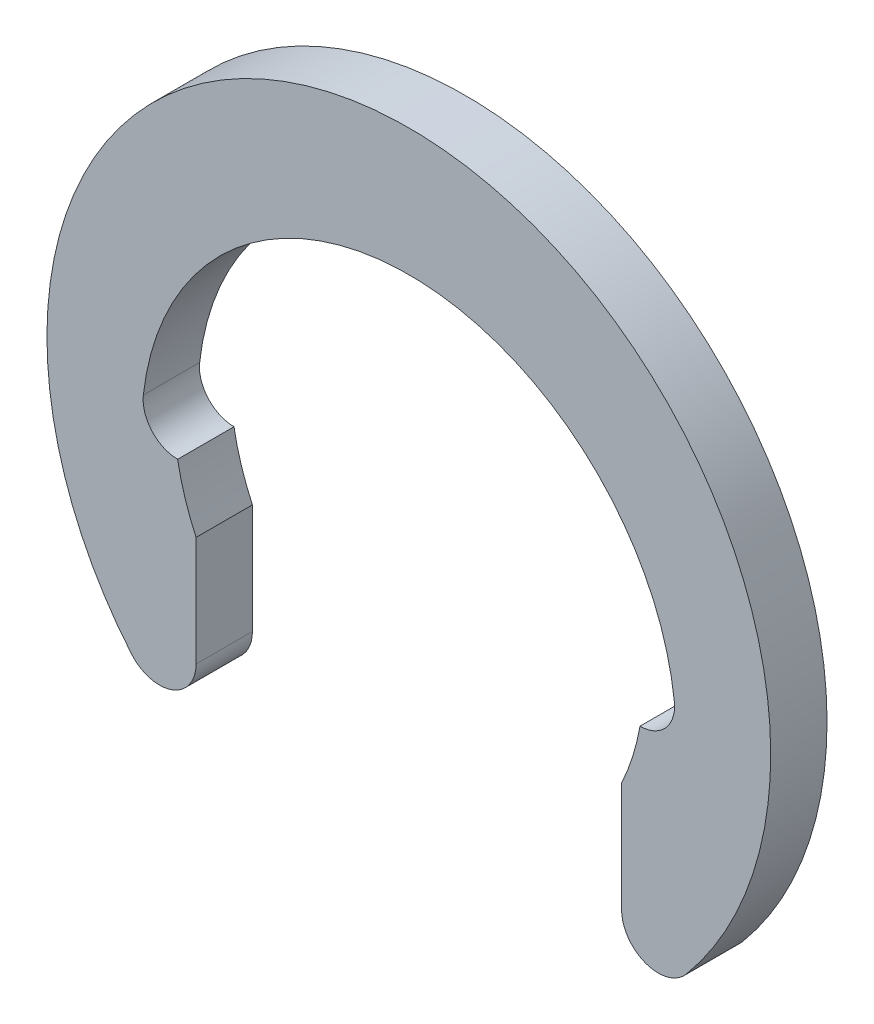
ISO-10303-21;
HEADER;
FILE_DESCRIPTION(('STEP AP214'),'2;1');
FILE_NAME('part.step','',(''),(''),'','','');
FILE_SCHEMA(('AUTOMOTIVE_DESIGN { 1 0 10303 214 1 1 1 1 }'));
ENDSEC;
DATA;
#1=APPLICATION_CONTEXT('core data for automotive mechanical design processes');
#2=APPLICATION_PROTOCOL_DEFINITION('international standard','automotive_design',2000,#1);
#3=PRODUCT_CONTEXT('',#1,'mechanical');
#4=PRODUCT('Part','Part','',(#3));
#5=PRODUCT_RELATED_PRODUCT_CATEGORY('part','',(#4));
#6=PRODUCT_DEFINITION_FORMATION('','',#4);
#7=PRODUCT_DEFINITION_CONTEXT('part definition',#1,'design');
#8=PRODUCT_DEFINITION('design','',#6,#7);
#9=PRODUCT_DEFINITION_SHAPE('','',#8);
#10=(LENGTH_UNIT() NAMED_UNIT(*) SI_UNIT(.MILLI.,.METRE.));
#11=(NAMED_UNIT(*) PLANE_ANGLE_UNIT() SI_UNIT($,.RADIAN.));
#12=(NAMED_UNIT(*) SI_UNIT($,.STERADIAN.) SOLID_ANGLE_UNIT());
#13=UNCERTAINTY_MEASURE_WITH_UNIT(LENGTH_MEASURE(1.E-05),#10,'distance_accuracy_value','');
#14=(GEOMETRIC_REPRESENTATION_CONTEXT(3) GLOBAL_UNCERTAINTY_ASSIGNED_CONTEXT((#13)) GLOBAL_UNIT_ASSIGNED_CONTEXT((#10,
#11,#12)) REPRESENTATION_CONTEXT('',''));
#15=CARTESIAN_POINT('',(0.,0.,0.));
#16=DIRECTION('',(0.,0.,1.));
#17=DIRECTION('',(1.,0.,0.));
#18=AXIS2_PLACEMENT_3D('',#15,#16,#17);
#19=CARTESIAN_POINT('',(0.,0.,-0.6));
#20=DIRECTION('',(0.,0.,1.));
#21=DIRECTION('',(1.,0.,0.));
#22=AXIS2_PLACEMENT_3D('',#19,#20,#21);
#23=CYLINDRICAL_SURFACE('',#22,2.5);
#24=CARTESIAN_POINT('',(0.,0.,0.));
#25=DIRECTION('',(0.,0.,-1.));
#26=DIRECTION('',(1.,0.,0.));
#27=AXIS2_PLACEMENT_3D('',#24,#25,#26);
#28=CIRCLE('',#27,2.5);
#29=CARTESIAN_POINT('',(-2.26576946759162,-1.05654565435175,0.));
#30=VERTEX_POINT('',#29);
#31=CARTESIAN_POINT('',(-2.46201938253052,-0.434120444167327,0.));
#32=VERTEX_POINT('',#31);
#33=EDGE_CURVE('E141',#30,#32,#28,.T.);
#34=ORIENTED_EDGE('',*,*,#33,.F.);
#35=DIRECTION('',(0.,0.,1.));
#36=VECTOR('',#35,1.);
#37=CARTESIAN_POINT('',(-2.26576946759162,-1.05654565435175,-0.6));
#38=LINE('',#37,#36);
#39=CARTESIAN_POINT('',(-2.26576946759162,-1.05654565435175,-0.6));
#40=VERTEX_POINT('',#39);
#41=EDGE_CURVE('E11',#40,#30,#38,.T.);
#42=ORIENTED_EDGE('',*,*,#41,.F.);
#43=CARTESIAN_POINT('',(0.,0.,-0.6));
#44=DIRECTION('',(0.,0.,-1.));
#45=DIRECTION('',(1.,0.,0.));
#46=AXIS2_PLACEMENT_3D('',#43,#44,#45);
#47=CIRCLE('',#46,2.5);
#48=CARTESIAN_POINT('',(-2.46201938253052,-0.434120444167327,-0.6));
#49=VERTEX_POINT('',#48);
#50=EDGE_CURVE('E167',#40,#49,#47,.T.);
#51=ORIENTED_EDGE('',*,*,#50,.T.);
#52=DIRECTION('',(0.,0.,1.));
#53=VECTOR('',#52,1.);
#54=CARTESIAN_POINT('',(-2.46201938253052,-0.434120444167327,-0.6));
#55=LINE('',#54,#53);
#56=EDGE_CURVE('E35',#49,#32,#55,.T.);
#57=ORIENTED_EDGE('',*,*,#56,.T.);
#58=EDGE_LOOP('',(#34,#42,#51,#57));
#59=FACE_BOUND('',#58,.T.);
#60=ADVANCED_FACE('F32',(#59),#23,.F.);
#61=CARTESIAN_POINT('',(-2.26576946759162,-1.05654565435175,-0.6));
#62=DIRECTION('',(1.,0.,0.));
#63=DIRECTION('',(0.,1.,0.));
#64=AXIS2_PLACEMENT_3D('',#61,#62,#63);
#65=PLANE('',#64);
#66=DIRECTION('',(0.,1.,0.));
#67=VECTOR('',#66,1.);
#68=CARTESIAN_POINT('',(-2.26576946759162,-1.05654565435175,0.));
#69=LINE('',#68,#67);
#70=CARTESIAN_POINT('',(-2.26576946759162,-2.22426150203894,0.));
#71=VERTEX_POINT('',#70);
#72=EDGE_CURVE('E165',#71,#30,#69,.T.);
#73=ORIENTED_EDGE('',*,*,#72,.F.);
#74=DIRECTION('',(0.,0.,1.));
#75=VECTOR('',#74,1.);
#76=CARTESIAN_POINT('',(-2.26576946759162,-2.22426150203894,-0.6));
#77=LINE('',#76,#75);
#78=CARTESIAN_POINT('',(-2.26576946759162,-2.22426150203894,-0.6));
#79=VERTEX_POINT('',#78);
#80=EDGE_CURVE('E41',#79,#71,#77,.T.);
#81=ORIENTED_EDGE('',*,*,#80,.F.);
#82=DIRECTION('',(0.,1.,0.));
#83=VECTOR('',#82,1.);
#84=CARTESIAN_POINT('',(-2.26576946759162,-1.05654565435175,-0.6));
#85=LINE('',#84,#83);
#86=EDGE_CURVE('E131',#79,#40,#85,.T.);
#87=ORIENTED_EDGE('',*,*,#86,.T.);
#88=ORIENTED_EDGE('',*,*,#41,.T.);
#89=EDGE_LOOP('',(#73,#81,#87,#88));
#90=FACE_BOUND('',#89,.T.);
#91=ADVANCED_FACE('F183',(#90),#65,.T.);
#92=CARTESIAN_POINT('',(-2.65576946759162,-2.22426150203894,-0.6));
#93=DIRECTION('',(0.,0.,1.));
#94=DIRECTION('',(1.,0.,0.));
#95=AXIS2_PLACEMENT_3D('',#92,#93,#94);
#96=CYLINDRICAL_SURFACE('',#95,0.390000000000001);
#97=CARTESIAN_POINT('',(-2.65576946759162,-2.22426150203894,0.));
#98=DIRECTION('',(0.,0.,1.));
#99=DIRECTION('',(1.,0.,0.));
#100=AXIS2_PLACEMENT_3D('',#97,#98,#99);
#101=CIRCLE('',#100,0.390000000000001);
#102=CARTESIAN_POINT('',(-2.9547591502553,-2.47467150515519,0.));
#103=VERTEX_POINT('',#102);
#104=EDGE_CURVE('E118',#103,#71,#101,.T.);
#105=ORIENTED_EDGE('',*,*,#104,.F.);
#106=DIRECTION('',(0.,0.,1.));
#107=VECTOR('',#106,1.);
#108=CARTESIAN_POINT('',(-2.9547591502553,-2.47467150515519,-0.6));
#109=LINE('',#108,#107);
#110=CARTESIAN_POINT('',(-2.9547591502553,-2.47467150515519,-0.6));
#111=VERTEX_POINT('',#110);
#112=EDGE_CURVE('E113',#111,#103,#109,.T.);
#113=ORIENTED_EDGE('',*,*,#112,.F.);
#114=CARTESIAN_POINT('',(-2.65576946759162,-2.22426150203894,-0.6));
#115=DIRECTION('',(0.,0.,1.));
#116=DIRECTION('',(1.,0.,0.));
#117=AXIS2_PLACEMENT_3D('',#114,#115,#116);
#118=CIRCLE('',#117,0.390000000000001);
#119=EDGE_CURVE('E116',#111,#79,#118,.T.);
#120=ORIENTED_EDGE('',*,*,#119,.T.);
#121=ORIENTED_EDGE('',*,*,#80,.T.);
#122=EDGE_LOOP('',(#105,#113,#120,#121));
#123=FACE_BOUND('',#122,.T.);
#124=ADVANCED_FACE('F115',(#123),#96,.T.);
#125=CARTESIAN_POINT('',(0.,0.,-0.6));
#126=DIRECTION('',(0.,0.,1.));
#127=DIRECTION('',(1.,0.,0.));
#128=AXIS2_PLACEMENT_3D('',#125,#126,#127);
#129=CYLINDRICAL_SURFACE('',#128,3.85416666666667);
#130=CARTESIAN_POINT('',(0.,0.,0.));
#131=DIRECTION('',(0.,0.,1.));
#132=DIRECTION('',(1.,0.,0.));
#133=AXIS2_PLACEMENT_3D('',#130,#131,#132);
#134=CIRCLE('',#133,3.85416666666667);
#135=CARTESIAN_POINT('',(2.9547591502553,-2.47467150515519,0.));
#136=VERTEX_POINT('',#135);
#137=EDGE_CURVE('E162',#136,#103,#134,.T.);
#138=ORIENTED_EDGE('',*,*,#137,.F.);
#139=DIRECTION('',(0.,0.,1.));
#140=VECTOR('',#139,1.);
#141=CARTESIAN_POINT('',(2.9547591502553,-2.47467150515519,-0.6));
#142=LINE('',#141,#140);
#143=CARTESIAN_POINT('',(2.9547591502553,-2.47467150515519,-0.6));
#144=VERTEX_POINT('',#143);
#145=EDGE_CURVE('E123',#144,#136,#142,.T.);
#146=ORIENTED_EDGE('',*,*,#145,.F.);
#147=CARTESIAN_POINT('',(0.,0.,-0.6));
#148=DIRECTION('',(0.,0.,1.));
#149=DIRECTION('',(1.,0.,0.));
#150=AXIS2_PLACEMENT_3D('',#147,#148,#149);
#151=CIRCLE('',#150,3.85416666666667);
#152=EDGE_CURVE('E129',#144,#111,#151,.T.);
#153=ORIENTED_EDGE('',*,*,#152,.T.);
#154=ORIENTED_EDGE('',*,*,#112,.T.);
#155=EDGE_LOOP('',(#138,#146,#153,#154));
#156=FACE_BOUND('',#155,.T.);
#157=ADVANCED_FACE('F133',(#156),#129,.T.);
#158=CARTESIAN_POINT('',(2.65576946759162,-2.22426150203894,-0.6));
#159=DIRECTION('',(0.,0.,1.));
#160=DIRECTION('',(1.,0.,0.));
#161=AXIS2_PLACEMENT_3D('',#158,#159,#160);
#162=CYLINDRICAL_SURFACE('',#161,0.390000000000001);
#163=CARTESIAN_POINT('',(2.65576946759162,-2.22426150203894,0.));
#164=DIRECTION('',(0.,0.,1.));
#165=DIRECTION('',(1.,0.,0.));
#166=AXIS2_PLACEMENT_3D('',#163,#164,#165);
#167=CIRCLE('',#166,0.390000000000001);
#168=CARTESIAN_POINT('',(2.26576946759162,-2.22426150203894,0.));
#169=VERTEX_POINT('',#168);
#170=EDGE_CURVE('E159',#169,#136,#167,.T.);
#171=ORIENTED_EDGE('',*,*,#170,.F.);
#172=DIRECTION('',(0.,0.,1.));
#173=VECTOR('',#172,1.);
#174=CARTESIAN_POINT('',(2.26576946759162,-2.22426150203894,-0.6));
#175=LINE('',#174,#173);
#176=CARTESIAN_POINT('',(2.26576946759162,-2.22426150203894,-0.6));
#177=VERTEX_POINT('',#176);
#178=EDGE_CURVE('E171',#177,#169,#175,.T.);
#179=ORIENTED_EDGE('',*,*,#178,.F.);
#180=CARTESIAN_POINT('',(2.65576946759162,-2.22426150203894,-0.6));
#181=DIRECTION('',(0.,0.,1.));
#182=DIRECTION('',(1.,0.,0.));
#183=AXIS2_PLACEMENT_3D('',#180,#181,#182);
#184=CIRCLE('',#183,0.390000000000001);
#185=EDGE_CURVE('E134',#177,#144,#184,.T.);
#186=ORIENTED_EDGE('',*,*,#185,.T.);
#187=ORIENTED_EDGE('',*,*,#145,.T.);
#188=EDGE_LOOP('',(#171,#179,#186,#187));
#189=FACE_BOUND('',#188,.T.);
#190=ADVANCED_FACE('F196',(#189),#162,.T.);
#191=CARTESIAN_POINT('',(2.26576946759162,-1.05654565435175,-0.6));
#192=DIRECTION('',(-1.,0.,0.));
#193=DIRECTION('',(0.,-1.,0.));
#194=AXIS2_PLACEMENT_3D('',#191,#192,#193);
#195=PLANE('',#194);
#196=DIRECTION('',(0.,-1.,0.));
#197=VECTOR('',#196,1.);
#198=CARTESIAN_POINT('',(2.26576946759162,-1.05654565435175,0.));
#199=LINE('',#198,#197);
#200=CARTESIAN_POINT('',(2.26576946759162,-1.05654565435175,0.));
#201=VERTEX_POINT('',#200);
#202=EDGE_CURVE('E156',#201,#169,#199,.T.);
#203=ORIENTED_EDGE('',*,*,#202,.F.);
#204=DIRECTION('',(0.,0.,1.));
#205=VECTOR('',#204,1.);
#206=CARTESIAN_POINT('',(2.26576946759162,-1.05654565435175,-0.6));
#207=LINE('',#206,#205);
#208=CARTESIAN_POINT('',(2.26576946759162,-1.05654565435175,-0.6));
#209=VERTEX_POINT('',#208);
#210=EDGE_CURVE('E173',#209,#201,#207,.T.);
#211=ORIENTED_EDGE('',*,*,#210,.F.);
#212=DIRECTION('',(0.,-1.,0.));
#213=VECTOR('',#212,1.);
#214=CARTESIAN_POINT('',(2.26576946759162,-1.05654565435175,-0.6));
#215=LINE('',#214,#213);
#216=EDGE_CURVE('E136',#209,#177,#215,.T.);
#217=ORIENTED_EDGE('',*,*,#216,.T.);
#218=ORIENTED_EDGE('',*,*,#178,.T.);
#219=EDGE_LOOP('',(#203,#211,#217,#218));
#220=FACE_BOUND('',#219,.T.);
#221=ADVANCED_FACE('F199',(#220),#195,.T.);
#222=CARTESIAN_POINT('',(0.,0.,-0.6));
#223=DIRECTION('',(0.,0.,1.));
#224=DIRECTION('',(1.,0.,0.));
#225=AXIS2_PLACEMENT_3D('',#222,#223,#224);
#226=CYLINDRICAL_SURFACE('',#225,2.5);
#227=CARTESIAN_POINT('',(0.,0.,0.));
#228=DIRECTION('',(0.,0.,-1.));
#229=DIRECTION('',(1.,0.,0.));
#230=AXIS2_PLACEMENT_3D('',#227,#228,#229);
#231=CIRCLE('',#230,2.5);
#232=CARTESIAN_POINT('',(2.46201938253052,-0.434120444167328,0.));
#233=VERTEX_POINT('',#232);
#234=EDGE_CURVE('E153',#233,#201,#231,.T.);
#235=ORIENTED_EDGE('',*,*,#234,.F.);
#236=DIRECTION('',(0.,0.,1.));
#237=VECTOR('',#236,1.);
#238=CARTESIAN_POINT('',(2.46201938253052,-0.434120444167328,-0.6));
#239=LINE('',#238,#237);
#240=CARTESIAN_POINT('',(2.46201938253052,-0.434120444167328,-0.6));
#241=VERTEX_POINT('',#240);
#242=EDGE_CURVE('E175',#241,#233,#239,.T.);
#243=ORIENTED_EDGE('',*,*,#242,.F.);
#244=CARTESIAN_POINT('',(0.,0.,-0.6));
#245=DIRECTION('',(0.,0.,-1.));
#246=DIRECTION('',(1.,0.,0.));
#247=AXIS2_PLACEMENT_3D('',#244,#245,#246);
#248=CIRCLE('',#247,2.5);
#249=EDGE_CURVE('E298',#241,#209,#248,.T.);
#250=ORIENTED_EDGE('',*,*,#249,.T.);
#251=ORIENTED_EDGE('',*,*,#210,.T.);
#252=EDGE_LOOP('',(#235,#243,#250,#251));
#253=FACE_BOUND('',#252,.T.);
#254=ADVANCED_FACE('F203',(#253),#226,.F.);
#255=CARTESIAN_POINT('',(2.46201938253052,-0.0659098803851561,-0.6));
#256=DIRECTION('',(0.,0.,1.));
#257=DIRECTION('',(1.,0.,0.));
#258=AXIS2_PLACEMENT_3D('',#255,#256,#257);
#259=CYLINDRICAL_SURFACE('',#258,0.368210563782171);
#260=CARTESIAN_POINT('',(2.46201938253052,-0.0659098803851561,0.));
#261=DIRECTION('',(0.,0.,-1.));
#262=DIRECTION('',(1.,0.,0.));
#263=AXIS2_PLACEMENT_3D('',#260,#261,#262);
#264=CIRCLE('',#263,0.368210563782171);
#265=CARTESIAN_POINT('',(2.82786798958246,-0.0242707641729126,0.));
#266=VERTEX_POINT('',#265);
#267=EDGE_CURVE('E150',#266,#233,#264,.T.);
#268=ORIENTED_EDGE('',*,*,#267,.F.);
#269=DIRECTION('',(0.,0.,1.));
#270=VECTOR('',#269,1.);
#271=CARTESIAN_POINT('',(2.82786798958246,-0.0242707641729126,-0.6));
#272=LINE('',#271,#270);
#273=CARTESIAN_POINT('',(2.82786798958246,-0.0242707641729126,-0.6));
#274=VERTEX_POINT('',#273);
#275=EDGE_CURVE('E177',#274,#266,#272,.T.);
#276=ORIENTED_EDGE('',*,*,#275,.F.);
#277=CARTESIAN_POINT('',(2.46201938253052,-0.0659098803851561,-0.6));
#278=DIRECTION('',(0.,0.,-1.));
#279=DIRECTION('',(1.,0.,0.));
#280=AXIS2_PLACEMENT_3D('',#277,#278,#279);
#281=CIRCLE('',#280,0.368210563782171);
#282=EDGE_CURVE('E294',#274,#241,#281,.T.);
#283=ORIENTED_EDGE('',*,*,#282,.T.);
#284=ORIENTED_EDGE('',*,*,#242,.T.);
#285=EDGE_LOOP('',(#268,#276,#283,#284));
#286=FACE_BOUND('',#285,.T.);
#287=ADVANCED_FACE('F207',(#286),#259,.F.);
#288=CARTESIAN_POINT('',(0.,-0.346125,-0.6));
#289=DIRECTION('',(0.,0.,1.));
#290=DIRECTION('',(1.,0.,0.));
#291=AXIS2_PLACEMENT_3D('',#288,#289,#290);
#292=CYLINDRICAL_SURFACE('',#291,2.846125);
#293=CARTESIAN_POINT('',(0.,-0.346125,0.));
#294=DIRECTION('',(0.,0.,-1.));
#295=DIRECTION('',(1.,0.,0.));
#296=AXIS2_PLACEMENT_3D('',#293,#294,#295);
#297=CIRCLE('',#296,2.846125);
#298=CARTESIAN_POINT('',(-2.82786798958246,-0.0242707641729125,0.));
#299=VERTEX_POINT('',#298);
#300=EDGE_CURVE('E147',#299,#266,#297,.T.);
#301=ORIENTED_EDGE('',*,*,#300,.F.);
#302=DIRECTION('',(0.,0.,1.));
#303=VECTOR('',#302,1.);
#304=CARTESIAN_POINT('',(-2.82786798958246,-0.0242707641729125,-0.6));
#305=LINE('',#304,#303);
#306=CARTESIAN_POINT('',(-2.82786798958246,-0.0242707641729125,-0.6));
#307=VERTEX_POINT('',#306);
#308=EDGE_CURVE('E178',#307,#299,#305,.T.);
#309=ORIENTED_EDGE('',*,*,#308,.F.);
#310=CARTESIAN_POINT('',(0.,-0.346125,-0.6));
#311=DIRECTION('',(0.,0.,-1.));
#312=DIRECTION('',(1.,0.,0.));
#313=AXIS2_PLACEMENT_3D('',#310,#311,#312);
#314=CIRCLE('',#313,2.846125);
#315=EDGE_CURVE('E305',#307,#274,#314,.T.);
#316=ORIENTED_EDGE('',*,*,#315,.T.);
#317=ORIENTED_EDGE('',*,*,#275,.T.);
#318=EDGE_LOOP('',(#301,#309,#316,#317));
#319=FACE_BOUND('',#318,.T.);
#320=ADVANCED_FACE('F211',(#319),#292,.F.);
#321=CARTESIAN_POINT('',(-2.46201938253052,-0.0659098803851561,-0.6));
#322=DIRECTION('',(0.,0.,1.));
#323=DIRECTION('',(1.,0.,0.));
#324=AXIS2_PLACEMENT_3D('',#321,#322,#323);
#325=CYLINDRICAL_SURFACE('',#324,0.368210563782171);
#326=CARTESIAN_POINT('',(-2.46201938253052,-0.0659098803851561,0.));
#327=DIRECTION('',(0.,0.,-1.));
#328=DIRECTION('',(1.,0.,0.));
#329=AXIS2_PLACEMENT_3D('',#326,#327,#328);
#330=CIRCLE('',#329,0.368210563782171);
#331=EDGE_CURVE('E144',#32,#299,#330,.T.);
#332=ORIENTED_EDGE('',*,*,#331,.F.);
#333=ORIENTED_EDGE('',*,*,#56,.F.);
#334=CARTESIAN_POINT('',(-2.46201938253052,-0.0659098803851561,-0.6));
#335=DIRECTION('',(0.,0.,-1.));
#336=DIRECTION('',(1.,0.,0.));
#337=AXIS2_PLACEMENT_3D('',#334,#335,#336);
#338=CIRCLE('',#337,0.368210563782171);
#339=EDGE_CURVE('E307',#49,#307,#338,.T.);
#340=ORIENTED_EDGE('',*,*,#339,.T.);
#341=ORIENTED_EDGE('',*,*,#308,.T.);
#342=EDGE_LOOP('',(#332,#333,#340,#341));
#343=FACE_BOUND('',#342,.T.);
#344=ADVANCED_FACE('F180',(#343),#325,.F.);
#345=CARTESIAN_POINT('',(0.,0.,-0.6));
#346=DIRECTION('',(0.,0.,1.));
#347=DIRECTION('',(1.,0.,0.));
#348=AXIS2_PLACEMENT_3D('',#345,#346,#347);
#349=PLANE('',#348);
#350=ORIENTED_EDGE('',*,*,#50,.F.);
#351=ORIENTED_EDGE('',*,*,#86,.F.);
#352=ORIENTED_EDGE('',*,*,#119,.F.);
#353=ORIENTED_EDGE('',*,*,#152,.F.);
#354=ORIENTED_EDGE('',*,*,#185,.F.);
#355=ORIENTED_EDGE('',*,*,#216,.F.);
#356=ORIENTED_EDGE('',*,*,#249,.F.);
#357=ORIENTED_EDGE('',*,*,#282,.F.);
#358=ORIENTED_EDGE('',*,*,#315,.F.);
#359=ORIENTED_EDGE('',*,*,#339,.F.);
#360=EDGE_LOOP('',(#350,#351,#352,#353,#354,#355,#356,#357,#358,#359));
#361=FACE_BOUND('',#360,.T.);
#362=ADVANCED_FACE('F127',(#361),#349,.F.);
#363=CARTESIAN_POINT('',(0.,0.,0.));
#364=DIRECTION('',(0.,0.,1.));
#365=DIRECTION('',(1.,0.,0.));
#366=AXIS2_PLACEMENT_3D('',#363,#364,#365);
#367=PLANE('',#366);
#368=ORIENTED_EDGE('',*,*,#33,.T.);
#369=ORIENTED_EDGE('',*,*,#331,.T.);
#370=ORIENTED_EDGE('',*,*,#300,.T.);
#371=ORIENTED_EDGE('',*,*,#267,.T.);
#372=ORIENTED_EDGE('',*,*,#234,.T.);
#373=ORIENTED_EDGE('',*,*,#202,.T.);
#374=ORIENTED_EDGE('',*,*,#170,.T.);
#375=ORIENTED_EDGE('',*,*,#137,.T.);
#376=ORIENTED_EDGE('',*,*,#104,.T.);
#377=ORIENTED_EDGE('',*,*,#72,.T.);
#378=EDGE_LOOP('',(#368,#369,#370,#371,#372,#373,#374,#375,#376,#377));
#379=FACE_BOUND('',#378,.T.);
#380=ADVANCED_FACE('F182',(#379),#367,.T.);
#381=CLOSED_SHELL('',(#60,#91,#124,#157,#190,#221,#254,#287,#320,#344,#362,#380));
#382=MANIFOLD_SOLID_BREP('B2',#381);
#383=ADVANCED_BREP_SHAPE_REPRESENTATION('',(#18,#382),#14);
#384=SHAPE_DEFINITION_REPRESENTATION(#9,#383);
ENDSEC;
END-ISO-10303-21;
